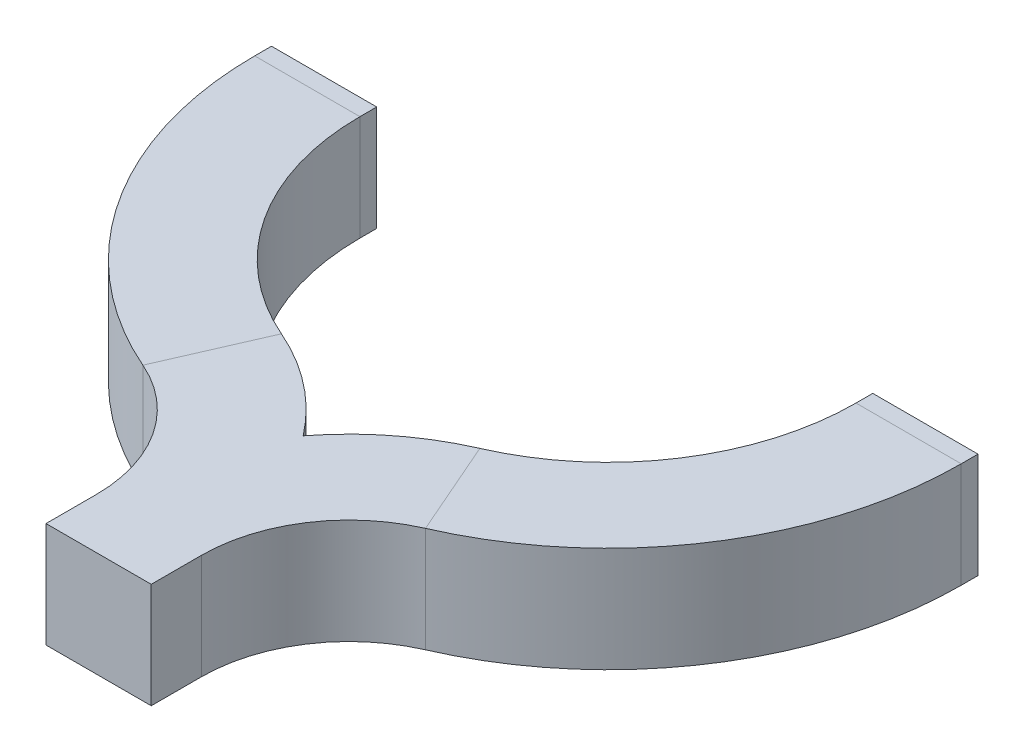
ISO-10303-21;
HEADER;
FILE_DESCRIPTION(('STEP AP214'),'2;1');
FILE_NAME('part.step','',(''),(''),'','','');
FILE_SCHEMA(('AUTOMOTIVE_DESIGN { 1 0 10303 214 1 1 1 1 }'));
ENDSEC;
DATA;
#1=APPLICATION_CONTEXT('core data for automotive mechanical design processes');
#2=APPLICATION_PROTOCOL_DEFINITION('international standard','automotive_design',2000,#1);
#3=PRODUCT_CONTEXT('',#1,'mechanical');
#4=PRODUCT('Part','Part','',(#3));
#5=PRODUCT_RELATED_PRODUCT_CATEGORY('part','',(#4));
#6=PRODUCT_DEFINITION_FORMATION('','',#4);
#7=PRODUCT_DEFINITION_CONTEXT('part definition',#1,'design');
#8=PRODUCT_DEFINITION('design','',#6,#7);
#9=PRODUCT_DEFINITION_SHAPE('','',#8);
#10=(LENGTH_UNIT() NAMED_UNIT(*) SI_UNIT(.MILLI.,.METRE.));
#11=(NAMED_UNIT(*) PLANE_ANGLE_UNIT() SI_UNIT($,.RADIAN.));
#12=(NAMED_UNIT(*) SI_UNIT($,.STERADIAN.) SOLID_ANGLE_UNIT());
#13=UNCERTAINTY_MEASURE_WITH_UNIT(LENGTH_MEASURE(1.E-05),#10,'distance_accuracy_value','');
#14=(GEOMETRIC_REPRESENTATION_CONTEXT(3) GLOBAL_UNCERTAINTY_ASSIGNED_CONTEXT((#13)) GLOBAL_UNIT_ASSIGNED_CONTEXT((#10,
#11,#12)) REPRESENTATION_CONTEXT('',''));
#15=CARTESIAN_POINT('',(0.,0.,0.));
#16=DIRECTION('',(0.,0.,1.));
#17=DIRECTION('',(1.,0.,0.));
#18=AXIS2_PLACEMENT_3D('',#15,#16,#17);
#19=CARTESIAN_POINT('',(1.05,1.05,1.));
#20=DIRECTION('',(-1.,0.,0.));
#21=DIRECTION('',(0.,-1.,0.));
#22=AXIS2_PLACEMENT_3D('',#19,#20,#21);
#23=PLANE('',#22);
#24=DIRECTION('',(0.,1.,0.));
#25=VECTOR('',#24,1.);
#26=CARTESIAN_POINT('',(1.05,1.05,-1.));
#27=LINE('',#26,#25);
#28=CARTESIAN_POINT('',(1.05,-1.05,-1.));
#29=VERTEX_POINT('',#28);
#30=CARTESIAN_POINT('',(1.05,1.05,-1.));
#31=VERTEX_POINT('',#30);
#32=EDGE_CURVE('E188',#29,#31,#27,.T.);
#33=ORIENTED_EDGE('',*,*,#32,.F.);
#34=DIRECTION('',(0.,0.,-1.));
#35=VECTOR('',#34,1.);
#36=CARTESIAN_POINT('',(1.05,-1.05,1.));
#37=LINE('',#36,#35);
#38=CARTESIAN_POINT('',(1.05,-1.05,-2.));
#39=VERTEX_POINT('',#38);
#40=EDGE_CURVE('E196',#29,#39,#37,.T.);
#41=ORIENTED_EDGE('',*,*,#40,.T.);
#42=DIRECTION('',(0.,1.,0.));
#43=VECTOR('',#42,1.);
#44=CARTESIAN_POINT('',(1.05,1.05,-2.));
#45=LINE('',#44,#43);
#46=CARTESIAN_POINT('',(1.05,1.05,-2.));
#47=VERTEX_POINT('',#46);
#48=EDGE_CURVE('E209',#39,#47,#45,.T.);
#49=ORIENTED_EDGE('',*,*,#48,.T.);
#50=DIRECTION('',(0.,0.,-1.));
#51=VECTOR('',#50,1.);
#52=CARTESIAN_POINT('',(1.05,1.05,1.));
#53=LINE('',#52,#51);
#54=EDGE_CURVE('E52',#31,#47,#53,.T.);
#55=ORIENTED_EDGE('',*,*,#54,.F.);
#56=EDGE_LOOP('',(#33,#41,#49,#55));
#57=FACE_BOUND('',#56,.T.);
#58=ADVANCED_FACE('F44',(#57),#23,.F.);
#59=CARTESIAN_POINT('',(-1.05,1.05,1.));
#60=DIRECTION('',(0.,-1.,0.));
#61=DIRECTION('',(0.,0.,-1.));
#62=AXIS2_PLACEMENT_3D('',#59,#60,#61);
#63=PLANE('',#62);
#64=DIRECTION('',(-1.,0.,0.));
#65=VECTOR('',#64,1.);
#66=CARTESIAN_POINT('',(-1.05,1.05,-1.));
#67=LINE('',#66,#65);
#68=CARTESIAN_POINT('',(-1.05,1.05,-1.));
#69=VERTEX_POINT('',#68);
#70=EDGE_CURVE('E198',#31,#69,#67,.T.);
#71=ORIENTED_EDGE('',*,*,#70,.F.);
#72=ORIENTED_EDGE('',*,*,#54,.T.);
#73=CARTESIAN_POINT('',(4.,1.05,-2.));
#74=DIRECTION('',(0.,1.,0.));
#75=DIRECTION('',(-0.400000107962682,0.,-0.916515091872383));
#76=AXIS2_PLACEMENT_3D('',#73,#74,#75);
#77=CIRCLE('',#76,2.95);
#78=CARTESIAN_POINT('',(2.8200002213235,1.05,-4.70371828415603));
#79=VERTEX_POINT('',#78);
#80=EDGE_CURVE('E218',#79,#47,#77,.T.);
#81=ORIENTED_EDGE('',*,*,#80,.F.);
#82=DIRECTION('',(0.400000107962682,0.,0.916515091872383));
#83=VECTOR('',#82,1.);
#84=CARTESIAN_POINT('',(2.8200002213235,1.05,-4.70371828415603));
#85=LINE('',#84,#83);
#86=CARTESIAN_POINT('',(1.97999999460187,1.05,-6.62839997708803));
#87=VERTEX_POINT('',#86);
#88=EDGE_CURVE('E225',#87,#79,#85,.T.);
#89=ORIENTED_EDGE('',*,*,#88,.F.);
#90=CARTESIAN_POINT('',(4.,1.05,-2.));
#91=DIRECTION('',(0.,1.,0.));
#92=DIRECTION('',(-0.400000107962682,0.,-0.916515091872383));
#93=AXIS2_PLACEMENT_3D('',#90,#91,#92);
#94=CIRCLE('',#93,5.05);
#95=CARTESIAN_POINT('',(0.,1.05,-5.08261252835967));
#96=VERTEX_POINT('',#95);
#97=EDGE_CURVE('E91',#87,#96,#94,.T.);
#98=ORIENTED_EDGE('',*,*,#97,.T.);
#99=CARTESIAN_POINT('',(-4.,1.05,-2.));
#100=DIRECTION('',(0.,-1.,0.));
#101=DIRECTION('',(0.400000107962682,0.,-0.916515091872383));
#102=AXIS2_PLACEMENT_3D('',#99,#100,#101);
#103=CIRCLE('',#102,5.05);
#104=CARTESIAN_POINT('',(-1.97999999460187,1.05,-6.62839997708803));
#105=VERTEX_POINT('',#104);
#106=EDGE_CURVE('E310',#105,#96,#103,.T.);
#107=ORIENTED_EDGE('',*,*,#106,.F.);
#108=DIRECTION('',(-0.400000107962682,0.,0.916515091872383));
#109=VECTOR('',#108,1.);
#110=CARTESIAN_POINT('',(-2.8200002213235,1.05,-4.70371828415603));
#111=LINE('',#110,#109);
#112=CARTESIAN_POINT('',(-2.8200002213235,1.05,-4.70371828415603));
#113=VERTEX_POINT('',#112);
#114=EDGE_CURVE('E306',#113,#105,#111,.F.);
#115=ORIENTED_EDGE('',*,*,#114,.F.);
#116=CARTESIAN_POINT('',(-4.,1.05,-2.));
#117=DIRECTION('',(0.,-1.,0.));
#118=DIRECTION('',(0.400000107962682,0.,-0.916515091872383));
#119=AXIS2_PLACEMENT_3D('',#116,#117,#118);
#120=CIRCLE('',#119,2.95);
#121=CARTESIAN_POINT('',(-1.05,1.05,-2.));
#122=VERTEX_POINT('',#121);
#123=EDGE_CURVE('E305',#113,#122,#120,.T.);
#124=ORIENTED_EDGE('',*,*,#123,.T.);
#125=DIRECTION('',(0.,0.,-1.));
#126=VECTOR('',#125,1.);
#127=CARTESIAN_POINT('',(-1.05,1.05,1.));
#128=LINE('',#127,#126);
#129=EDGE_CURVE('E206',#69,#122,#128,.T.);
#130=ORIENTED_EDGE('',*,*,#129,.F.);
#131=EDGE_LOOP('',(#71,#72,#81,#89,#98,#107,#115,#124,#130));
#132=FACE_BOUND('',#131,.T.);
#133=ADVANCED_FACE('F217',(#132),#63,.F.);
#134=CARTESIAN_POINT('',(-1.05,1.05,1.));
#135=DIRECTION('',(1.,0.,0.));
#136=DIRECTION('',(0.,1.,0.));
#137=AXIS2_PLACEMENT_3D('',#134,#135,#136);
#138=PLANE('',#137);
#139=DIRECTION('',(0.,-1.,0.));
#140=VECTOR('',#139,1.);
#141=CARTESIAN_POINT('',(-1.05,1.05,-1.));
#142=LINE('',#141,#140);
#143=CARTESIAN_POINT('',(-1.05,-1.05,-1.));
#144=VERTEX_POINT('',#143);
#145=EDGE_CURVE('E59',#69,#144,#142,.T.);
#146=ORIENTED_EDGE('',*,*,#145,.F.);
#147=ORIENTED_EDGE('',*,*,#129,.T.);
#148=DIRECTION('',(0.,-1.,0.));
#149=VECTOR('',#148,1.);
#150=CARTESIAN_POINT('',(-1.05,1.05,-2.));
#151=LINE('',#150,#149);
#152=CARTESIAN_POINT('',(-1.05,-1.05,-2.));
#153=VERTEX_POINT('',#152);
#154=EDGE_CURVE('E202',#122,#153,#151,.T.);
#155=ORIENTED_EDGE('',*,*,#154,.T.);
#156=DIRECTION('',(0.,0.,-1.));
#157=VECTOR('',#156,1.);
#158=CARTESIAN_POINT('',(-1.05,-1.05,1.));
#159=LINE('',#158,#157);
#160=EDGE_CURVE('E67',#144,#153,#159,.T.);
#161=ORIENTED_EDGE('',*,*,#160,.F.);
#162=EDGE_LOOP('',(#146,#147,#155,#161));
#163=FACE_BOUND('',#162,.T.);
#164=ADVANCED_FACE('F402',(#163),#138,.F.);
#165=CARTESIAN_POINT('',(-1.05,-1.05,1.));
#166=DIRECTION('',(0.,1.,0.));
#167=DIRECTION('',(0.,0.,1.));
#168=AXIS2_PLACEMENT_3D('',#165,#166,#167);
#169=PLANE('',#168);
#170=DIRECTION('',(1.,0.,0.));
#171=VECTOR('',#170,1.);
#172=CARTESIAN_POINT('',(-1.05,-1.05,-1.));
#173=LINE('',#172,#171);
#174=EDGE_CURVE('E185',#144,#29,#173,.T.);
#175=ORIENTED_EDGE('',*,*,#174,.F.);
#176=ORIENTED_EDGE('',*,*,#160,.T.);
#177=CARTESIAN_POINT('',(-4.,-1.05,-2.));
#178=DIRECTION('',(0.,-1.,0.));
#179=DIRECTION('',(0.400000107962682,0.,-0.916515091872383));
#180=AXIS2_PLACEMENT_3D('',#177,#178,#179);
#181=CIRCLE('',#180,2.95);
#182=CARTESIAN_POINT('',(-2.8200002213235,-1.05,-4.70371828415603));
#183=VERTEX_POINT('',#182);
#184=EDGE_CURVE('E327',#183,#153,#181,.T.);
#185=ORIENTED_EDGE('',*,*,#184,.F.);
#186=DIRECTION('',(0.400000107962682,0.,-0.916515091872383));
#187=VECTOR('',#186,1.);
#188=CARTESIAN_POINT('',(-2.8200002213235,-1.05,-4.70371828415603));
#189=LINE('',#188,#187);
#190=CARTESIAN_POINT('',(-1.97999999460187,-1.05,-6.62839997708803));
#191=VERTEX_POINT('',#190);
#192=EDGE_CURVE('E354',#191,#183,#189,.F.);
#193=ORIENTED_EDGE('',*,*,#192,.F.);
#194=CARTESIAN_POINT('',(-4.,-1.05,-2.));
#195=DIRECTION('',(0.,-1.,0.));
#196=DIRECTION('',(0.400000107962682,0.,-0.916515091872383));
#197=AXIS2_PLACEMENT_3D('',#194,#195,#196);
#198=CIRCLE('',#197,5.05);
#199=CARTESIAN_POINT('',(0.,-1.05,-5.08261252835967));
#200=VERTEX_POINT('',#199);
#201=EDGE_CURVE('E350',#191,#200,#198,.T.);
#202=ORIENTED_EDGE('',*,*,#201,.T.);
#203=CARTESIAN_POINT('',(4.,-1.05,-2.));
#204=DIRECTION('',(0.,1.,0.));
#205=DIRECTION('',(-0.400000107962682,0.,-0.916515091872383));
#206=AXIS2_PLACEMENT_3D('',#203,#204,#205);
#207=CIRCLE('',#206,5.05);
#208=CARTESIAN_POINT('',(1.97999999460187,-1.05,-6.62839997708803));
#209=VERTEX_POINT('',#208);
#210=EDGE_CURVE('E100',#209,#200,#207,.T.);
#211=ORIENTED_EDGE('',*,*,#210,.F.);
#212=DIRECTION('',(-0.400000107962682,0.,-0.916515091872383));
#213=VECTOR('',#212,1.);
#214=CARTESIAN_POINT('',(2.8200002213235,-1.05,-4.70371828415603));
#215=LINE('',#214,#213);
#216=CARTESIAN_POINT('',(2.8200002213235,-1.05,-4.70371828415603));
#217=VERTEX_POINT('',#216);
#218=EDGE_CURVE('E269',#217,#209,#215,.T.);
#219=ORIENTED_EDGE('',*,*,#218,.F.);
#220=CARTESIAN_POINT('',(4.,-1.05,-2.));
#221=DIRECTION('',(0.,1.,0.));
#222=DIRECTION('',(-0.400000107962682,0.,-0.916515091872383));
#223=AXIS2_PLACEMENT_3D('',#220,#221,#222);
#224=CIRCLE('',#223,2.95);
#225=EDGE_CURVE('E107',#217,#39,#224,.T.);
#226=ORIENTED_EDGE('',*,*,#225,.T.);
#227=ORIENTED_EDGE('',*,*,#40,.F.);
#228=EDGE_LOOP('',(#175,#176,#185,#193,#202,#211,#219,#226,#227));
#229=FACE_BOUND('',#228,.T.);
#230=ADVANCED_FACE('F200',(#229),#169,.F.);
#231=CARTESIAN_POINT('',(4.,0.,-2.));
#232=DIRECTION('',(0.,1.,0.));
#233=DIRECTION('',(0.,0.,1.));
#234=AXIS2_PLACEMENT_3D('',#231,#232,#233);
#235=CYLINDRICAL_SURFACE('',#234,5.05);
#236=DIRECTION('',(0.,-1.,0.));
#237=VECTOR('',#236,1.);
#238=CARTESIAN_POINT('',(0.,0.,-5.08261252835967));
#239=LINE('',#238,#237);
#240=EDGE_CURVE('E11',#96,#200,#239,.T.);
#241=ORIENTED_EDGE('',*,*,#240,.F.);
#242=ORIENTED_EDGE('',*,*,#97,.F.);
#243=DIRECTION('',(0.,1.,0.));
#244=VECTOR('',#243,1.);
#245=CARTESIAN_POINT('',(1.97999999460187,1.05,-6.62839997708803));
#246=LINE('',#245,#244);
#247=EDGE_CURVE('E249',#209,#87,#246,.T.);
#248=ORIENTED_EDGE('',*,*,#247,.F.);
#249=ORIENTED_EDGE('',*,*,#210,.T.);
#250=EDGE_LOOP('',(#241,#242,#248,#249));
#251=FACE_BOUND('',#250,.T.);
#252=ADVANCED_FACE('F418',(#251),#235,.T.);
#253=CARTESIAN_POINT('',(5.99999919028007,0.,-11.5));
#254=DIRECTION('',(0.,0.,-1.));
#255=DIRECTION('',(-1.,0.,0.));
#256=AXIS2_PLACEMENT_3D('',#253,#254,#255);
#257=PLANE('',#256);
#258=DIRECTION('',(0.,1.,0.));
#259=VECTOR('',#258,1.);
#260=CARTESIAN_POINT('',(4.94999919028007,1.05,-11.5));
#261=LINE('',#260,#259);
#262=CARTESIAN_POINT('',(4.94999919028007,-1.05,-11.5));
#263=VERTEX_POINT('',#262);
#264=CARTESIAN_POINT('',(4.94999919028007,1.05,-11.5));
#265=VERTEX_POINT('',#264);
#266=EDGE_CURVE('E244',#263,#265,#261,.T.);
#267=ORIENTED_EDGE('',*,*,#266,.T.);
#268=DIRECTION('',(1.,0.,0.));
#269=VECTOR('',#268,1.);
#270=CARTESIAN_POINT('',(7.04999919028007,1.05,-11.5));
#271=LINE('',#270,#269);
#272=CARTESIAN_POINT('',(7.04999919028007,1.05,-11.5));
#273=VERTEX_POINT('',#272);
#274=EDGE_CURVE('E240',#265,#273,#271,.T.);
#275=ORIENTED_EDGE('',*,*,#274,.T.);
#276=DIRECTION('',(0.,-1.,0.));
#277=VECTOR('',#276,1.);
#278=CARTESIAN_POINT('',(7.04999919028007,1.05,-11.5));
#279=LINE('',#278,#277);
#280=CARTESIAN_POINT('',(7.04999919028007,-1.05,-11.5));
#281=VERTEX_POINT('',#280);
#282=EDGE_CURVE('E282',#273,#281,#279,.T.);
#283=ORIENTED_EDGE('',*,*,#282,.T.);
#284=DIRECTION('',(-1.,0.,0.));
#285=VECTOR('',#284,1.);
#286=CARTESIAN_POINT('',(7.04999919028007,-1.05,-11.5));
#287=LINE('',#286,#285);
#288=EDGE_CURVE('E264',#281,#263,#287,.T.);
#289=ORIENTED_EDGE('',*,*,#288,.T.);
#290=EDGE_LOOP('',(#267,#275,#283,#289));
#291=FACE_BOUND('',#290,.T.);
#292=ADVANCED_FACE('F439',(#291),#257,.T.);
#293=CARTESIAN_POINT('',(7.04999919028007,1.05,-11.5));
#294=DIRECTION('',(-1.,0.,0.));
#295=DIRECTION('',(0.,0.,1.));
#296=AXIS2_PLACEMENT_3D('',#293,#294,#295);
#297=PLANE('',#296);
#298=DIRECTION('',(0.,0.,1.));
#299=VECTOR('',#298,1.);
#300=CARTESIAN_POINT('',(7.04999919028007,-1.05,-11.5));
#301=LINE('',#300,#299);
#302=CARTESIAN_POINT('',(7.04999919028007,-1.05,-11.1651484449888));
#303=VERTEX_POINT('',#302);
#304=EDGE_CURVE('E279',#281,#303,#301,.T.);
#305=ORIENTED_EDGE('',*,*,#304,.F.);
#306=ORIENTED_EDGE('',*,*,#282,.F.);
#307=DIRECTION('',(0.,0.,1.));
#308=VECTOR('',#307,1.);
#309=CARTESIAN_POINT('',(7.04999919028007,1.05,-11.5));
#310=LINE('',#309,#308);
#311=CARTESIAN_POINT('',(7.04999919028007,1.05,-11.1651484449888));
#312=VERTEX_POINT('',#311);
#313=EDGE_CURVE('E243',#273,#312,#310,.T.);
#314=ORIENTED_EDGE('',*,*,#313,.T.);
#315=DIRECTION('',(0.,-1.,0.));
#316=VECTOR('',#315,1.);
#317=CARTESIAN_POINT('',(7.04999919028007,1.05,-11.1651484449888));
#318=LINE('',#317,#316);
#319=EDGE_CURVE('E295',#312,#303,#318,.T.);
#320=ORIENTED_EDGE('',*,*,#319,.T.);
#321=EDGE_LOOP('',(#305,#306,#314,#320));
#322=FACE_BOUND('',#321,.T.);
#323=ADVANCED_FACE('F437',(#322),#297,.F.);
#324=CARTESIAN_POINT('',(7.04999919028007,-1.05,-11.5));
#325=DIRECTION('',(0.,1.,0.));
#326=DIRECTION('',(0.,0.,1.));
#327=AXIS2_PLACEMENT_3D('',#324,#325,#326);
#328=PLANE('',#327);
#329=DIRECTION('',(0.,0.,1.));
#330=VECTOR('',#329,1.);
#331=CARTESIAN_POINT('',(4.94999919028007,-1.05,-11.5));
#332=LINE('',#331,#330);
#333=CARTESIAN_POINT('',(4.94999919028007,-1.05,-11.1651484449888));
#334=VERTEX_POINT('',#333);
#335=EDGE_CURVE('E260',#263,#334,#332,.T.);
#336=ORIENTED_EDGE('',*,*,#335,.F.);
#337=ORIENTED_EDGE('',*,*,#288,.F.);
#338=ORIENTED_EDGE('',*,*,#304,.T.);
#339=DIRECTION('',(-1.,0.,0.));
#340=VECTOR('',#339,1.);
#341=CARTESIAN_POINT('',(7.04999919028007,-1.05,-11.1651484449888));
#342=LINE('',#341,#340);
#343=EDGE_CURVE('E275',#303,#334,#342,.T.);
#344=ORIENTED_EDGE('',*,*,#343,.T.);
#345=EDGE_LOOP('',(#336,#337,#338,#344));
#346=FACE_BOUND('',#345,.T.);
#347=ADVANCED_FACE('F434',(#346),#328,.F.);
#348=CARTESIAN_POINT('',(4.94999919028007,1.05,-11.5));
#349=DIRECTION('',(1.,0.,0.));
#350=DIRECTION('',(0.,0.,-1.));
#351=AXIS2_PLACEMENT_3D('',#348,#349,#350);
#352=PLANE('',#351);
#353=DIRECTION('',(0.,0.,1.));
#354=VECTOR('',#353,1.);
#355=CARTESIAN_POINT('',(4.94999919028007,1.05,-11.5));
#356=LINE('',#355,#354);
#357=CARTESIAN_POINT('',(4.94999919028007,1.05,-11.1651484449888));
#358=VERTEX_POINT('',#357);
#359=EDGE_CURVE('E239',#265,#358,#356,.T.);
#360=ORIENTED_EDGE('',*,*,#359,.F.);
#361=ORIENTED_EDGE('',*,*,#266,.F.);
#362=ORIENTED_EDGE('',*,*,#335,.T.);
#363=DIRECTION('',(0.,1.,0.));
#364=VECTOR('',#363,1.);
#365=CARTESIAN_POINT('',(4.94999919028007,1.05,-11.1651484449888));
#366=LINE('',#365,#364);
#367=EDGE_CURVE('E256',#334,#358,#366,.T.);
#368=ORIENTED_EDGE('',*,*,#367,.T.);
#369=EDGE_LOOP('',(#360,#361,#362,#368));
#370=FACE_BOUND('',#369,.T.);
#371=ADVANCED_FACE('F431',(#370),#352,.F.);
#372=CARTESIAN_POINT('',(7.04999919028007,1.05,-11.5));
#373=DIRECTION('',(0.,-1.,0.));
#374=DIRECTION('',(1.,0.,0.));
#375=AXIS2_PLACEMENT_3D('',#372,#373,#374);
#376=PLANE('',#375);
#377=DIRECTION('',(1.,0.,0.));
#378=VECTOR('',#377,1.);
#379=CARTESIAN_POINT('',(7.04999919028007,1.05,-11.1651484449888));
#380=LINE('',#379,#378);
#381=EDGE_CURVE('E234',#358,#312,#380,.T.);
#382=ORIENTED_EDGE('',*,*,#381,.T.);
#383=ORIENTED_EDGE('',*,*,#313,.F.);
#384=ORIENTED_EDGE('',*,*,#274,.F.);
#385=ORIENTED_EDGE('',*,*,#359,.T.);
#386=EDGE_LOOP('',(#382,#383,#384,#385));
#387=FACE_BOUND('',#386,.T.);
#388=ADVANCED_FACE('F428',(#387),#376,.F.);
#389=CARTESIAN_POINT('',(0.,0.,-11.1651484449888));
#390=DIRECTION('',(0.,-1.,0.));
#391=DIRECTION('',(0.,0.,-1.));
#392=AXIS2_PLACEMENT_3D('',#389,#390,#391);
#393=CYLINDRICAL_SURFACE('',#392,7.04999865046684);
#394=CARTESIAN_POINT('',(0.,-1.05,-11.1651484449888));
#395=DIRECTION('',(0.,-1.,0.));
#396=DIRECTION('',(1.,0.,0.));
#397=AXIS2_PLACEMENT_3D('',#394,#395,#396);
#398=CIRCLE('',#397,7.04999865046684);
#399=EDGE_CURVE('E127',#303,#217,#398,.T.);
#400=ORIENTED_EDGE('',*,*,#399,.F.);
#401=ORIENTED_EDGE('',*,*,#319,.F.);
#402=CARTESIAN_POINT('',(0.,1.05,-11.1651484449888));
#403=DIRECTION('',(0.,-1.,0.));
#404=DIRECTION('',(1.,0.,0.));
#405=AXIS2_PLACEMENT_3D('',#402,#403,#404);
#406=CIRCLE('',#405,7.04999865046684);
#407=EDGE_CURVE('E238',#312,#79,#406,.T.);
#408=ORIENTED_EDGE('',*,*,#407,.T.);
#409=DIRECTION('',(0.,-1.,0.));
#410=VECTOR('',#409,1.);
#411=CARTESIAN_POINT('',(2.8200002213235,1.05,-4.70371828415603));
#412=LINE('',#411,#410);
#413=EDGE_CURVE('E222',#79,#217,#412,.T.);
#414=ORIENTED_EDGE('',*,*,#413,.T.);
#415=EDGE_LOOP('',(#400,#401,#408,#414));
#416=FACE_BOUND('',#415,.T.);
#417=ADVANCED_FACE('F425',(#416),#393,.T.);
#418=CARTESIAN_POINT('',(7.04999865046684,-1.05,-11.1651484449888));
#419=DIRECTION('',(0.,1.,0.));
#420=DIRECTION('',(0.,0.,1.));
#421=AXIS2_PLACEMENT_3D('',#418,#419,#420);
#422=PLANE('',#421);
#423=CARTESIAN_POINT('',(0.,-1.05,-11.1651484449888));
#424=DIRECTION('',(0.,-1.,0.));
#425=DIRECTION('',(1.,0.,0.));
#426=AXIS2_PLACEMENT_3D('',#423,#424,#425);
#427=CIRCLE('',#426,4.94999865046684);
#428=EDGE_CURVE('E120',#334,#209,#427,.T.);
#429=ORIENTED_EDGE('',*,*,#428,.F.);
#430=ORIENTED_EDGE('',*,*,#343,.F.);
#431=ORIENTED_EDGE('',*,*,#399,.T.);
#432=ORIENTED_EDGE('',*,*,#218,.T.);
#433=EDGE_LOOP('',(#429,#430,#431,#432));
#434=FACE_BOUND('',#433,.T.);
#435=ADVANCED_FACE('F424',(#434),#422,.F.);
#436=CARTESIAN_POINT('',(0.,0.,-11.1651484449888));
#437=DIRECTION('',(0.,-1.,0.));
#438=DIRECTION('',(0.,0.,-1.));
#439=AXIS2_PLACEMENT_3D('',#436,#437,#438);
#440=CYLINDRICAL_SURFACE('',#439,4.94999865046684);
#441=CARTESIAN_POINT('',(0.,1.05,-11.1651484449888));
#442=DIRECTION('',(0.,-1.,0.));
#443=DIRECTION('',(1.,0.,0.));
#444=AXIS2_PLACEMENT_3D('',#441,#442,#443);
#445=CIRCLE('',#444,4.94999865046684);
#446=EDGE_CURVE('E233',#358,#87,#445,.T.);
#447=ORIENTED_EDGE('',*,*,#446,.F.);
#448=ORIENTED_EDGE('',*,*,#367,.F.);
#449=ORIENTED_EDGE('',*,*,#428,.T.);
#450=ORIENTED_EDGE('',*,*,#247,.T.);
#451=EDGE_LOOP('',(#447,#448,#449,#450));
#452=FACE_BOUND('',#451,.T.);
#453=ADVANCED_FACE('F423',(#452),#440,.F.);
#454=CARTESIAN_POINT('',(7.04999865046684,1.05,-11.1651484449888));
#455=DIRECTION('',(0.,-1.,0.));
#456=DIRECTION('',(0.,0.,-1.));
#457=AXIS2_PLACEMENT_3D('',#454,#455,#456);
#458=PLANE('',#457);
#459=ORIENTED_EDGE('',*,*,#88,.T.);
#460=ORIENTED_EDGE('',*,*,#407,.F.);
#461=ORIENTED_EDGE('',*,*,#381,.F.);
#462=ORIENTED_EDGE('',*,*,#446,.T.);
#463=EDGE_LOOP('',(#459,#460,#461,#462));
#464=FACE_BOUND('',#463,.T.);
#465=ADVANCED_FACE('F421',(#464),#458,.F.);
#466=CARTESIAN_POINT('',(4.,0.,-2.));
#467=DIRECTION('',(0.,1.,0.));
#468=DIRECTION('',(0.,0.,1.));
#469=AXIS2_PLACEMENT_3D('',#466,#467,#468);
#470=CYLINDRICAL_SURFACE('',#469,2.95);
#471=ORIENTED_EDGE('',*,*,#225,.F.);
#472=ORIENTED_EDGE('',*,*,#413,.F.);
#473=ORIENTED_EDGE('',*,*,#80,.T.);
#474=ORIENTED_EDGE('',*,*,#48,.F.);
#475=EDGE_LOOP('',(#471,#472,#473,#474));
#476=FACE_BOUND('',#475,.T.);
#477=ADVANCED_FACE('F221',(#476),#470,.F.);
#478=CARTESIAN_POINT('',(-4.,0.,-2.));
#479=DIRECTION('',(0.,-1.,0.));
#480=DIRECTION('',(0.,0.,-1.));
#481=AXIS2_PLACEMENT_3D('',#478,#479,#480);
#482=CYLINDRICAL_SURFACE('',#481,5.05);
#483=ORIENTED_EDGE('',*,*,#106,.T.);
#484=ORIENTED_EDGE('',*,*,#240,.T.);
#485=ORIENTED_EDGE('',*,*,#201,.F.);
#486=DIRECTION('',(0.,1.,0.));
#487=VECTOR('',#486,1.);
#488=CARTESIAN_POINT('',(-1.97999999460187,1.05,-6.62839997708803));
#489=LINE('',#488,#487);
#490=EDGE_CURVE('E378',#105,#191,#489,.F.);
#491=ORIENTED_EDGE('',*,*,#490,.F.);
#492=EDGE_LOOP('',(#483,#484,#485,#491));
#493=FACE_BOUND('',#492,.T.);
#494=ADVANCED_FACE('F417',(#493),#482,.T.);
#495=CARTESIAN_POINT('',(-5.99999919028007,0.,-11.5));
#496=DIRECTION('',(0.,0.,-1.));
#497=DIRECTION('',(1.,0.,0.));
#498=AXIS2_PLACEMENT_3D('',#495,#496,#497);
#499=PLANE('',#498);
#500=DIRECTION('',(0.,1.,0.));
#501=VECTOR('',#500,1.);
#502=CARTESIAN_POINT('',(-4.94999919028007,1.05,-11.5));
#503=LINE('',#502,#501);
#504=CARTESIAN_POINT('',(-4.94999919028007,1.05,-11.5));
#505=VERTEX_POINT('',#504);
#506=CARTESIAN_POINT('',(-4.94999919028007,-1.05,-11.5));
#507=VERTEX_POINT('',#506);
#508=EDGE_CURVE('E370',#505,#507,#503,.F.);
#509=ORIENTED_EDGE('',*,*,#508,.T.);
#510=DIRECTION('',(1.,0.,0.));
#511=VECTOR('',#510,1.);
#512=CARTESIAN_POINT('',(-7.04999919028007,-1.05,-11.5));
#513=LINE('',#512,#511);
#514=CARTESIAN_POINT('',(-7.04999919028007,-1.05,-11.5));
#515=VERTEX_POINT('',#514);
#516=EDGE_CURVE('E347',#507,#515,#513,.F.);
#517=ORIENTED_EDGE('',*,*,#516,.T.);
#518=DIRECTION('',(0.,-1.,0.));
#519=VECTOR('',#518,1.);
#520=CARTESIAN_POINT('',(-7.04999919028007,1.05,-11.5));
#521=LINE('',#520,#519);
#522=CARTESIAN_POINT('',(-7.04999919028007,1.05,-11.5));
#523=VERTEX_POINT('',#522);
#524=EDGE_CURVE('E323',#515,#523,#521,.F.);
#525=ORIENTED_EDGE('',*,*,#524,.T.);
#526=DIRECTION('',(-1.,0.,0.));
#527=VECTOR('',#526,1.);
#528=CARTESIAN_POINT('',(-7.04999919028007,1.05,-11.5));
#529=LINE('',#528,#527);
#530=EDGE_CURVE('E318',#523,#505,#529,.F.);
#531=ORIENTED_EDGE('',*,*,#530,.T.);
#532=EDGE_LOOP('',(#509,#517,#525,#531));
#533=FACE_BOUND('',#532,.T.);
#534=ADVANCED_FACE('F451',(#533),#499,.T.);
#535=CARTESIAN_POINT('',(-4.94999919028007,1.05,-11.5));
#536=DIRECTION('',(-1.,0.,0.));
#537=DIRECTION('',(0.,0.,1.));
#538=AXIS2_PLACEMENT_3D('',#535,#536,#537);
#539=PLANE('',#538);
#540=DIRECTION('',(0.,0.,1.));
#541=VECTOR('',#540,1.);
#542=CARTESIAN_POINT('',(-4.94999919028007,-1.05,-11.5));
#543=LINE('',#542,#541);
#544=CARTESIAN_POINT('',(-4.94999919028007,-1.05,-11.1651484449888));
#545=VERTEX_POINT('',#544);
#546=EDGE_CURVE('E366',#507,#545,#543,.T.);
#547=ORIENTED_EDGE('',*,*,#546,.F.);
#548=ORIENTED_EDGE('',*,*,#508,.F.);
#549=DIRECTION('',(0.,0.,1.));
#550=VECTOR('',#549,1.);
#551=CARTESIAN_POINT('',(-4.94999919028007,1.05,-11.5));
#552=LINE('',#551,#550);
#553=CARTESIAN_POINT('',(-4.94999919028007,1.05,-11.1651484449888));
#554=VERTEX_POINT('',#553);
#555=EDGE_CURVE('E322',#505,#554,#552,.T.);
#556=ORIENTED_EDGE('',*,*,#555,.T.);
#557=DIRECTION('',(0.,1.,0.));
#558=VECTOR('',#557,1.);
#559=CARTESIAN_POINT('',(-4.94999919028007,1.05,-11.1651484449888));
#560=LINE('',#559,#558);
#561=EDGE_CURVE('E388',#554,#545,#560,.F.);
#562=ORIENTED_EDGE('',*,*,#561,.T.);
#563=EDGE_LOOP('',(#547,#548,#556,#562));
#564=FACE_BOUND('',#563,.T.);
#565=ADVANCED_FACE('F585',(#564),#539,.F.);
#566=CARTESIAN_POINT('',(-7.04999919028007,-1.05,-11.5));
#567=DIRECTION('',(0.,1.,0.));
#568=DIRECTION('',(0.,0.,1.));
#569=AXIS2_PLACEMENT_3D('',#566,#567,#568);
#570=PLANE('',#569);
#571=DIRECTION('',(0.,0.,1.));
#572=VECTOR('',#571,1.);
#573=CARTESIAN_POINT('',(-7.04999919028007,-1.05,-11.5));
#574=LINE('',#573,#572);
#575=CARTESIAN_POINT('',(-7.04999919028007,-1.05,-11.1651484449888));
#576=VERTEX_POINT('',#575);
#577=EDGE_CURVE('E343',#515,#576,#574,.T.);
#578=ORIENTED_EDGE('',*,*,#577,.F.);
#579=ORIENTED_EDGE('',*,*,#516,.F.);
#580=ORIENTED_EDGE('',*,*,#546,.T.);
#581=DIRECTION('',(1.,0.,0.));
#582=VECTOR('',#581,1.);
#583=CARTESIAN_POINT('',(-7.04999919028007,-1.05,-11.1651484449888));
#584=LINE('',#583,#582);
#585=EDGE_CURVE('E362',#545,#576,#584,.F.);
#586=ORIENTED_EDGE('',*,*,#585,.T.);
#587=EDGE_LOOP('',(#578,#579,#580,#586));
#588=FACE_BOUND('',#587,.T.);
#589=ADVANCED_FACE('F575',(#588),#570,.F.);
#590=CARTESIAN_POINT('',(-7.04999919028007,1.05,-11.5));
#591=DIRECTION('',(1.,0.,0.));
#592=DIRECTION('',(0.,0.,-1.));
#593=AXIS2_PLACEMENT_3D('',#590,#591,#592);
#594=PLANE('',#593);
#595=DIRECTION('',(0.,0.,1.));
#596=VECTOR('',#595,1.);
#597=CARTESIAN_POINT('',(-7.04999919028007,1.05,-11.5));
#598=LINE('',#597,#596);
#599=CARTESIAN_POINT('',(-7.04999919028007,1.05,-11.1651484449888));
#600=VERTEX_POINT('',#599);
#601=EDGE_CURVE('E317',#523,#600,#598,.T.);
#602=ORIENTED_EDGE('',*,*,#601,.F.);
#603=ORIENTED_EDGE('',*,*,#524,.F.);
#604=ORIENTED_EDGE('',*,*,#577,.T.);
#605=DIRECTION('',(0.,-1.,0.));
#606=VECTOR('',#605,1.);
#607=CARTESIAN_POINT('',(-7.04999919028007,1.05,-11.1651484449888));
#608=LINE('',#607,#606);
#609=EDGE_CURVE('E339',#576,#600,#608,.F.);
#610=ORIENTED_EDGE('',*,*,#609,.T.);
#611=EDGE_LOOP('',(#602,#603,#604,#610));
#612=FACE_BOUND('',#611,.T.);
#613=ADVANCED_FACE('F565',(#612),#594,.F.);
#614=CARTESIAN_POINT('',(-7.04999919028007,1.05,-11.5));
#615=DIRECTION('',(0.,-1.,0.));
#616=DIRECTION('',(1.,0.,0.));
#617=AXIS2_PLACEMENT_3D('',#614,#615,#616);
#618=PLANE('',#617);
#619=DIRECTION('',(-1.,0.,0.));
#620=VECTOR('',#619,1.);
#621=CARTESIAN_POINT('',(-7.04999919028007,1.05,-11.1651484449888));
#622=LINE('',#621,#620);
#623=EDGE_CURVE('E312',#600,#554,#622,.F.);
#624=ORIENTED_EDGE('',*,*,#623,.T.);
#625=ORIENTED_EDGE('',*,*,#555,.F.);
#626=ORIENTED_EDGE('',*,*,#530,.F.);
#627=ORIENTED_EDGE('',*,*,#601,.T.);
#628=EDGE_LOOP('',(#624,#625,#626,#627));
#629=FACE_BOUND('',#628,.T.);
#630=ADVANCED_FACE('F556',(#629),#618,.F.);
#631=CARTESIAN_POINT('',(0.,0.,-11.1651484449888));
#632=DIRECTION('',(0.,1.,0.));
#633=DIRECTION('',(0.,0.,1.));
#634=AXIS2_PLACEMENT_3D('',#631,#632,#633);
#635=CYLINDRICAL_SURFACE('',#634,4.94999865046684);
#636=CARTESIAN_POINT('',(0.,-1.05,-11.1651484449888));
#637=DIRECTION('',(0.,1.,0.));
#638=DIRECTION('',(-1.,0.,0.));
#639=AXIS2_PLACEMENT_3D('',#636,#637,#638);
#640=CIRCLE('',#639,4.94999865046684);
#641=EDGE_CURVE('E358',#545,#191,#640,.T.);
#642=ORIENTED_EDGE('',*,*,#641,.F.);
#643=ORIENTED_EDGE('',*,*,#561,.F.);
#644=CARTESIAN_POINT('',(0.,1.05,-11.1651484449888));
#645=DIRECTION('',(0.,1.,0.));
#646=DIRECTION('',(-1.,0.,0.));
#647=AXIS2_PLACEMENT_3D('',#644,#645,#646);
#648=CIRCLE('',#647,4.94999865046684);
#649=EDGE_CURVE('E316',#554,#105,#648,.T.);
#650=ORIENTED_EDGE('',*,*,#649,.T.);
#651=ORIENTED_EDGE('',*,*,#490,.T.);
#652=EDGE_LOOP('',(#642,#643,#650,#651));
#653=FACE_BOUND('',#652,.T.);
#654=ADVANCED_FACE('F415',(#653),#635,.F.);
#655=CARTESIAN_POINT('',(-7.04999865046684,-1.05,-11.1651484449888));
#656=DIRECTION('',(0.,1.,0.));
#657=DIRECTION('',(0.,0.,1.));
#658=AXIS2_PLACEMENT_3D('',#655,#656,#657);
#659=PLANE('',#658);
#660=CARTESIAN_POINT('',(0.,-1.05,-11.1651484449888));
#661=DIRECTION('',(0.,1.,0.));
#662=DIRECTION('',(-1.,0.,0.));
#663=AXIS2_PLACEMENT_3D('',#660,#661,#662);
#664=CIRCLE('',#663,7.04999865046684);
#665=EDGE_CURVE('E335',#576,#183,#664,.T.);
#666=ORIENTED_EDGE('',*,*,#665,.F.);
#667=ORIENTED_EDGE('',*,*,#585,.F.);
#668=ORIENTED_EDGE('',*,*,#641,.T.);
#669=ORIENTED_EDGE('',*,*,#192,.T.);
#670=EDGE_LOOP('',(#666,#667,#668,#669));
#671=FACE_BOUND('',#670,.T.);
#672=ADVANCED_FACE('F411',(#671),#659,.F.);
#673=CARTESIAN_POINT('',(0.,0.,-11.1651484449888));
#674=DIRECTION('',(0.,1.,0.));
#675=DIRECTION('',(0.,0.,1.));
#676=AXIS2_PLACEMENT_3D('',#673,#674,#675);
#677=CYLINDRICAL_SURFACE('',#676,7.04999865046684);
#678=CARTESIAN_POINT('',(0.,1.05,-11.1651484449888));
#679=DIRECTION('',(0.,1.,0.));
#680=DIRECTION('',(-1.,0.,0.));
#681=AXIS2_PLACEMENT_3D('',#678,#679,#680);
#682=CIRCLE('',#681,7.04999865046684);
#683=EDGE_CURVE('E311',#600,#113,#682,.T.);
#684=ORIENTED_EDGE('',*,*,#683,.F.);
#685=ORIENTED_EDGE('',*,*,#609,.F.);
#686=ORIENTED_EDGE('',*,*,#665,.T.);
#687=DIRECTION('',(0.,-1.,0.));
#688=VECTOR('',#687,1.);
#689=CARTESIAN_POINT('',(-2.8200002213235,1.05,-4.70371828415603));
#690=LINE('',#689,#688);
#691=EDGE_CURVE('E331',#183,#113,#690,.F.);
#692=ORIENTED_EDGE('',*,*,#691,.T.);
#693=EDGE_LOOP('',(#684,#685,#686,#692));
#694=FACE_BOUND('',#693,.T.);
#695=ADVANCED_FACE('F529',(#694),#677,.T.);
#696=CARTESIAN_POINT('',(-7.04999865046684,1.05,-11.1651484449888));
#697=DIRECTION('',(0.,-1.,0.));
#698=DIRECTION('',(0.,0.,-1.));
#699=AXIS2_PLACEMENT_3D('',#696,#697,#698);
#700=PLANE('',#699);
#701=ORIENTED_EDGE('',*,*,#114,.T.);
#702=ORIENTED_EDGE('',*,*,#649,.F.);
#703=ORIENTED_EDGE('',*,*,#623,.F.);
#704=ORIENTED_EDGE('',*,*,#683,.T.);
#705=EDGE_LOOP('',(#701,#702,#703,#704));
#706=FACE_BOUND('',#705,.T.);
#707=ADVANCED_FACE('F520',(#706),#700,.F.);
#708=CARTESIAN_POINT('',(-4.,0.,-2.));
#709=DIRECTION('',(0.,-1.,0.));
#710=DIRECTION('',(0.,0.,-1.));
#711=AXIS2_PLACEMENT_3D('',#708,#709,#710);
#712=CYLINDRICAL_SURFACE('',#711,2.95);
#713=ORIENTED_EDGE('',*,*,#123,.F.);
#714=ORIENTED_EDGE('',*,*,#691,.F.);
#715=ORIENTED_EDGE('',*,*,#184,.T.);
#716=ORIENTED_EDGE('',*,*,#154,.F.);
#717=EDGE_LOOP('',(#713,#714,#715,#716));
#718=FACE_BOUND('',#717,.T.);
#719=ADVANCED_FACE('F407',(#718),#712,.F.);
#720=CARTESIAN_POINT('',(0.,0.,-1.));
#721=DIRECTION('',(0.,0.,1.));
#722=DIRECTION('',(1.,0.,0.));
#723=AXIS2_PLACEMENT_3D('',#720,#721,#722);
#724=PLANE('',#723);
#725=ORIENTED_EDGE('',*,*,#145,.T.);
#726=ORIENTED_EDGE('',*,*,#174,.T.);
#727=ORIENTED_EDGE('',*,*,#32,.T.);
#728=ORIENTED_EDGE('',*,*,#70,.T.);
#729=EDGE_LOOP('',(#725,#726,#727,#728));
#730=FACE_BOUND('',#729,.T.);
#731=ADVANCED_FACE('F187',(#730),#724,.T.);
#732=CLOSED_SHELL('',(#58,#133,#164,#230,#252,#292,#323,#347,#371,#388,#417,#435,#453,#465,#477,
#494,#534,#565,#589,#613,#630,#654,#672,#695,#707,#719,#731));
#733=MANIFOLD_SOLID_BREP('B2',#732);
#734=ADVANCED_BREP_SHAPE_REPRESENTATION('',(#18,#733),#14);
#735=SHAPE_DEFINITION_REPRESENTATION(#9,#734);
ENDSEC;
END-ISO-10303-21;
